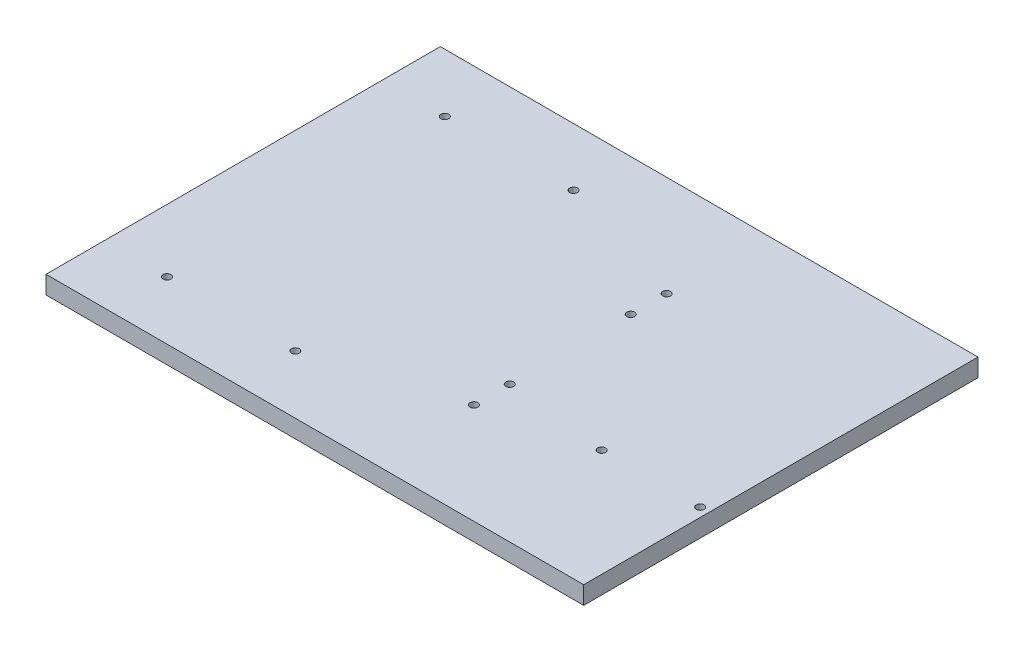
ISO-10303-21;
HEADER;
FILE_DESCRIPTION(('STEP AP214'),'2;1');
FILE_NAME('part.step','',(''),(''),'','','');
FILE_SCHEMA(('AUTOMOTIVE_DESIGN { 1 0 10303 214 1 1 1 1 }'));
ENDSEC;
DATA;
#1=APPLICATION_CONTEXT('core data for automotive mechanical design processes');
#2=APPLICATION_PROTOCOL_DEFINITION('international standard','automotive_design',2000,#1);
#3=PRODUCT_CONTEXT('',#1,'mechanical');
#4=PRODUCT('Part','Part','',(#3));
#5=PRODUCT_RELATED_PRODUCT_CATEGORY('part','',(#4));
#6=PRODUCT_DEFINITION_FORMATION('','',#4);
#7=PRODUCT_DEFINITION_CONTEXT('part definition',#1,'design');
#8=PRODUCT_DEFINITION('design','',#6,#7);
#9=PRODUCT_DEFINITION_SHAPE('','',#8);
#10=(LENGTH_UNIT() NAMED_UNIT(*) SI_UNIT(.MILLI.,.METRE.));
#11=(NAMED_UNIT(*) PLANE_ANGLE_UNIT() SI_UNIT($,.RADIAN.));
#12=(NAMED_UNIT(*) SI_UNIT($,.STERADIAN.) SOLID_ANGLE_UNIT());
#13=UNCERTAINTY_MEASURE_WITH_UNIT(LENGTH_MEASURE(1.E-05),#10,'distance_accuracy_value','');
#14=(GEOMETRIC_REPRESENTATION_CONTEXT(3) GLOBAL_UNCERTAINTY_ASSIGNED_CONTEXT((#13)) GLOBAL_UNIT_ASSIGNED_CONTEXT((#10,
#11,#12)) REPRESENTATION_CONTEXT('',''));
#15=CARTESIAN_POINT('',(0.,0.,0.));
#16=DIRECTION('',(0.,0.,1.));
#17=DIRECTION('',(1.,0.,0.));
#18=AXIS2_PLACEMENT_3D('',#15,#16,#17);
#19=CARTESIAN_POINT('',(0.,6.34999999999999,0.));
#20=DIRECTION('',(1.,0.,0.));
#21=DIRECTION('',(0.,0.,-1.));
#22=AXIS2_PLACEMENT_3D('',#19,#20,#21);
#23=PLANE('',#22);
#24=DIRECTION('',(0.,0.,1.));
#25=VECTOR('',#24,1.);
#26=CARTESIAN_POINT('',(0.,0.,0.));
#27=LINE('',#26,#25);
#28=CARTESIAN_POINT('',(0.,0.,-304.8));
#29=VERTEX_POINT('',#28);
#30=CARTESIAN_POINT('',(0.,0.,-165.1));
#31=VERTEX_POINT('',#30);
#32=EDGE_CURVE('E105',#29,#31,#27,.T.);
#33=ORIENTED_EDGE('',*,*,#32,.T.);
#34=DIRECTION('',(0.,1.,0.));
#35=VECTOR('',#34,1.);
#36=CARTESIAN_POINT('',(0.,0.,-165.1));
#37=LINE('',#36,#35);
#38=CARTESIAN_POINT('',(0.,6.34999999999999,-165.1));
#39=VERTEX_POINT('',#38);
#40=EDGE_CURVE('E108',#31,#39,#37,.T.);
#41=ORIENTED_EDGE('',*,*,#40,.T.);
#42=DIRECTION('',(0.,0.,1.));
#43=VECTOR('',#42,1.);
#44=CARTESIAN_POINT('',(0.,6.34999999999999,0.));
#45=LINE('',#44,#43);
#46=CARTESIAN_POINT('',(0.,6.34999999999999,-304.8));
#47=VERTEX_POINT('',#46);
#48=EDGE_CURVE('E106',#47,#39,#45,.T.);
#49=ORIENTED_EDGE('',*,*,#48,.F.);
#50=DIRECTION('',(0.,-1.,0.));
#51=VECTOR('',#50,1.);
#52=CARTESIAN_POINT('',(0.,6.34999999999999,-304.8));
#53=LINE('',#52,#51);
#54=EDGE_CURVE('E13',#47,#29,#53,.T.);
#55=ORIENTED_EDGE('',*,*,#54,.T.);
#56=EDGE_LOOP('',(#33,#41,#49,#55));
#57=FACE_BOUND('',#56,.T.);
#58=ADVANCED_FACE('F48',(#57),#23,.F.);
#59=CARTESIAN_POINT('',(0.,6.34999999999999,-304.8));
#60=DIRECTION('',(0.,0.,1.));
#61=DIRECTION('',(1.,0.,0.));
#62=AXIS2_PLACEMENT_3D('',#59,#60,#61);
#63=PLANE('',#62);
#64=DIRECTION('',(-1.,0.,0.));
#65=VECTOR('',#64,1.);
#66=CARTESIAN_POINT('',(0.,6.34999999999999,-304.8));
#67=LINE('',#66,#65);
#68=CARTESIAN_POINT('',(190.5,6.34999999999999,-304.8));
#69=VERTEX_POINT('',#68);
#70=EDGE_CURVE('E55',#69,#47,#67,.T.);
#71=ORIENTED_EDGE('',*,*,#70,.F.);
#72=DIRECTION('',(0.,1.,0.));
#73=VECTOR('',#72,1.);
#74=CARTESIAN_POINT('',(190.5,0.,-304.8));
#75=LINE('',#74,#73);
#76=CARTESIAN_POINT('',(190.5,0.,-304.8));
#77=VERTEX_POINT('',#76);
#78=EDGE_CURVE('E92',#77,#69,#75,.T.);
#79=ORIENTED_EDGE('',*,*,#78,.F.);
#80=DIRECTION('',(-1.,0.,0.));
#81=VECTOR('',#80,1.);
#82=CARTESIAN_POINT('',(0.,0.,-304.8));
#83=LINE('',#82,#81);
#84=EDGE_CURVE('E100',#77,#29,#83,.T.);
#85=ORIENTED_EDGE('',*,*,#84,.T.);
#86=ORIENTED_EDGE('',*,*,#54,.F.);
#87=EDGE_LOOP('',(#71,#79,#85,#86));
#88=FACE_BOUND('',#87,.T.);
#89=ADVANCED_FACE('F99',(#88),#63,.F.);
#90=CARTESIAN_POINT('',(0.,6.34999999999999,0.));
#91=DIRECTION('',(0.,-1.,0.));
#92=DIRECTION('',(0.,0.,-1.));
#93=AXIS2_PLACEMENT_3D('',#90,#91,#92);
#94=PLANE('',#93);
#95=CARTESIAN_POINT('',(187.325,6.34999999999999,-209.55));
#96=DIRECTION('',(0.,1.,0.));
#97=DIRECTION('',(0.,0.,1.));
#98=AXIS2_PLACEMENT_3D('',#95,#96,#97);
#99=CIRCLE('',#98,1.38906250000001);
#100=CARTESIAN_POINT('',(187.325,6.34999999999999,-208.1609375));
#101=VERTEX_POINT('',#100);
#102=EDGE_CURVE('E174',#101,#101,#99,.T.);
#103=ORIENTED_EDGE('',*,*,#102,.F.);
#104=EDGE_LOOP('',(#103));
#105=FACE_BOUND('',#104,.T.);
#106=CARTESIAN_POINT('',(152.4,6.34999999999999,-209.55));
#107=DIRECTION('',(0.,1.,0.));
#108=DIRECTION('',(0.,0.,1.));
#109=AXIS2_PLACEMENT_3D('',#106,#107,#108);
#110=CIRCLE('',#109,1.38906250000001);
#111=CARTESIAN_POINT('',(152.4,6.34999999999999,-208.1609375));
#112=VERTEX_POINT('',#111);
#113=EDGE_CURVE('E168',#112,#112,#110,.T.);
#114=ORIENTED_EDGE('',*,*,#113,.F.);
#115=EDGE_LOOP('',(#114));
#116=FACE_BOUND('',#115,.T.);
#117=CARTESIAN_POINT('',(115.8875,6.34999999999999,-269.08125));
#118=DIRECTION('',(0.,1.,0.));
#119=DIRECTION('',(0.,0.,1.));
#120=AXIS2_PLACEMENT_3D('',#117,#118,#119);
#121=CIRCLE('',#120,1.38906249999999);
#122=CARTESIAN_POINT('',(115.8875,6.34999999999999,-267.6921875));
#123=VERTEX_POINT('',#122);
#124=EDGE_CURVE('E157',#123,#123,#121,.T.);
#125=ORIENTED_EDGE('',*,*,#124,.F.);
#126=EDGE_LOOP('',(#125));
#127=FACE_BOUND('',#126,.T.);
#128=CARTESIAN_POINT('',(115.8875,6.34999999999999,-213.51875));
#129=DIRECTION('',(0.,1.,0.));
#130=DIRECTION('',(0.,0.,1.));
#131=AXIS2_PLACEMENT_3D('',#128,#129,#130);
#132=CIRCLE('',#131,1.3890625);
#133=CARTESIAN_POINT('',(115.8875,6.34999999999999,-212.1296875));
#134=VERTEX_POINT('',#133);
#135=EDGE_CURVE('E158',#134,#134,#132,.T.);
#136=ORIENTED_EDGE('',*,*,#135,.F.);
#137=EDGE_LOOP('',(#136));
#138=FACE_BOUND('',#137,.T.);
#139=CARTESIAN_POINT('',(115.8875,6.34999999999999,-200.81875));
#140=DIRECTION('',(0.,1.,0.));
#141=DIRECTION('',(0.,0.,1.));
#142=AXIS2_PLACEMENT_3D('',#139,#140,#141);
#143=CIRCLE('',#142,1.3890625);
#144=CARTESIAN_POINT('',(115.8875,6.34999999999999,-199.4296875));
#145=VERTEX_POINT('',#144);
#146=EDGE_CURVE('E144',#145,#145,#143,.T.);
#147=ORIENTED_EDGE('',*,*,#146,.F.);
#148=EDGE_LOOP('',(#147));
#149=FACE_BOUND('',#148,.T.);
#150=CARTESIAN_POINT('',(115.8875,6.34999999999999,-256.38125));
#151=DIRECTION('',(0.,1.,0.));
#152=DIRECTION('',(0.,0.,1.));
#153=AXIS2_PLACEMENT_3D('',#150,#151,#152);
#154=CIRCLE('',#153,1.38906249999996);
#155=CARTESIAN_POINT('',(115.8875,6.34999999999999,-254.9921875));
#156=VERTEX_POINT('',#155);
#157=EDGE_CURVE('E151',#156,#156,#154,.T.);
#158=ORIENTED_EDGE('',*,*,#157,.F.);
#159=EDGE_LOOP('',(#158));
#160=FACE_BOUND('',#159,.T.);
#161=CARTESIAN_POINT('',(67.691,6.34999999999999,-185.7375));
#162=DIRECTION('',(0.,1.,0.));
#163=DIRECTION('',(0.,0.,1.));
#164=AXIS2_PLACEMENT_3D('',#161,#162,#163);
#165=CIRCLE('',#164,1.3890625);
#166=CARTESIAN_POINT('',(67.691,6.34999999999999,-184.3484375));
#167=VERTEX_POINT('',#166);
#168=EDGE_CURVE('E133',#167,#167,#165,.T.);
#169=ORIENTED_EDGE('',*,*,#168,.F.);
#170=EDGE_LOOP('',(#169));
#171=FACE_BOUND('',#170,.T.);
#172=CARTESIAN_POINT('',(22.225,6.34999999999999,-284.1625));
#173=DIRECTION('',(0.,1.,0.));
#174=DIRECTION('',(0.,0.,1.));
#175=AXIS2_PLACEMENT_3D('',#172,#173,#174);
#176=CIRCLE('',#175,1.38906249999999);
#177=CARTESIAN_POINT('',(22.225,6.34999999999999,-282.7734375));
#178=VERTEX_POINT('',#177);
#179=EDGE_CURVE('E126',#178,#178,#176,.T.);
#180=ORIENTED_EDGE('',*,*,#179,.F.);
#181=EDGE_LOOP('',(#180));
#182=FACE_BOUND('',#181,.T.);
#183=CARTESIAN_POINT('',(67.691,6.34999999999999,-284.320434064186));
#184=DIRECTION('',(0.,1.,0.));
#185=DIRECTION('',(0.,0.,1.));
#186=AXIS2_PLACEMENT_3D('',#183,#184,#185);
#187=CIRCLE('',#186,1.38906249999999);
#188=CARTESIAN_POINT('',(67.691,6.34999999999999,-282.931371564186));
#189=VERTEX_POINT('',#188);
#190=EDGE_CURVE('E138',#189,#189,#187,.T.);
#191=ORIENTED_EDGE('',*,*,#190,.F.);
#192=EDGE_LOOP('',(#191));
#193=FACE_BOUND('',#192,.T.);
#194=CARTESIAN_POINT('',(22.225,6.34999999999999,-185.7375));
#195=DIRECTION('',(0.,1.,0.));
#196=DIRECTION('',(0.,0.,1.));
#197=AXIS2_PLACEMENT_3D('',#194,#195,#196);
#198=CIRCLE('',#197,1.38906250000001);
#199=CARTESIAN_POINT('',(22.225,6.34999999999999,-184.3484375));
#200=VERTEX_POINT('',#199);
#201=EDGE_CURVE('E120',#200,#200,#198,.T.);
#202=ORIENTED_EDGE('',*,*,#201,.F.);
#203=EDGE_LOOP('',(#202));
#204=FACE_BOUND('',#203,.T.);
#205=ORIENTED_EDGE('',*,*,#48,.T.);
#206=DIRECTION('',(-1.,0.,0.));
#207=VECTOR('',#206,1.);
#208=CARTESIAN_POINT('',(190.5,6.34999999999999,-165.1));
#209=LINE('',#208,#207);
#210=CARTESIAN_POINT('',(190.5,6.34999999999999,-165.1));
#211=VERTEX_POINT('',#210);
#212=EDGE_CURVE('E96',#211,#39,#209,.T.);
#213=ORIENTED_EDGE('',*,*,#212,.F.);
#214=DIRECTION('',(0.,0.,1.));
#215=VECTOR('',#214,1.);
#216=CARTESIAN_POINT('',(190.5,6.34999999999999,-304.8));
#217=LINE('',#216,#215);
#218=EDGE_CURVE('E116',#69,#211,#217,.T.);
#219=ORIENTED_EDGE('',*,*,#218,.F.);
#220=ORIENTED_EDGE('',*,*,#70,.T.);
#221=EDGE_LOOP('',(#205,#213,#219,#220));
#222=FACE_BOUND('',#221,.T.);
#223=ADVANCED_FACE('F189',(#105,#116,#127,#138,#149,#160,#171,#182,#193,#204,#222),#94,.F.);
#224=CARTESIAN_POINT('',(0.,0.,0.));
#225=DIRECTION('',(0.,-1.,0.));
#226=DIRECTION('',(0.,0.,-1.));
#227=AXIS2_PLACEMENT_3D('',#224,#225,#226);
#228=PLANE('',#227);
#229=CARTESIAN_POINT('',(187.325,0.,-209.55));
#230=DIRECTION('',(0.,1.,0.));
#231=DIRECTION('',(0.,0.,1.));
#232=AXIS2_PLACEMENT_3D('',#229,#230,#231);
#233=CIRCLE('',#232,1.38906250000001);
#234=CARTESIAN_POINT('',(187.325,0.,-208.1609375));
#235=VERTEX_POINT('',#234);
#236=EDGE_CURVE('E161',#235,#235,#233,.T.);
#237=ORIENTED_EDGE('',*,*,#236,.T.);
#238=EDGE_LOOP('',(#237));
#239=FACE_BOUND('',#238,.T.);
#240=CARTESIAN_POINT('',(152.4,0.,-209.55));
#241=DIRECTION('',(0.,1.,0.));
#242=DIRECTION('',(0.,0.,1.));
#243=AXIS2_PLACEMENT_3D('',#240,#241,#242);
#244=CIRCLE('',#243,1.38906250000001);
#245=CARTESIAN_POINT('',(152.4,0.,-208.1609375));
#246=VERTEX_POINT('',#245);
#247=EDGE_CURVE('E171',#246,#246,#244,.T.);
#248=ORIENTED_EDGE('',*,*,#247,.T.);
#249=EDGE_LOOP('',(#248));
#250=FACE_BOUND('',#249,.T.);
#251=CARTESIAN_POINT('',(115.8875,0.,-269.08125));
#252=DIRECTION('',(0.,1.,0.));
#253=DIRECTION('',(0.,0.,1.));
#254=AXIS2_PLACEMENT_3D('',#251,#252,#253);
#255=CIRCLE('',#254,1.38906249999999);
#256=CARTESIAN_POINT('',(115.8875,0.,-267.6921875));
#257=VERTEX_POINT('',#256);
#258=EDGE_CURVE('E141',#257,#257,#255,.T.);
#259=ORIENTED_EDGE('',*,*,#258,.T.);
#260=EDGE_LOOP('',(#259));
#261=FACE_BOUND('',#260,.T.);
#262=CARTESIAN_POINT('',(115.8875,0.,-213.51875));
#263=DIRECTION('',(0.,1.,0.));
#264=DIRECTION('',(0.,0.,1.));
#265=AXIS2_PLACEMENT_3D('',#262,#263,#264);
#266=CIRCLE('',#265,1.3890625);
#267=CARTESIAN_POINT('',(115.8875,0.,-212.1296875));
#268=VERTEX_POINT('',#267);
#269=EDGE_CURVE('E148',#268,#268,#266,.T.);
#270=ORIENTED_EDGE('',*,*,#269,.T.);
#271=EDGE_LOOP('',(#270));
#272=FACE_BOUND('',#271,.T.);
#273=CARTESIAN_POINT('',(115.8875,0.,-200.81875));
#274=DIRECTION('',(0.,1.,0.));
#275=DIRECTION('',(0.,0.,1.));
#276=AXIS2_PLACEMENT_3D('',#273,#274,#275);
#277=CIRCLE('',#276,1.3890625);
#278=CARTESIAN_POINT('',(115.8875,0.,-199.4296875));
#279=VERTEX_POINT('',#278);
#280=EDGE_CURVE('E147',#279,#279,#277,.T.);
#281=ORIENTED_EDGE('',*,*,#280,.T.);
#282=EDGE_LOOP('',(#281));
#283=FACE_BOUND('',#282,.T.);
#284=CARTESIAN_POINT('',(115.8875,0.,-256.38125));
#285=DIRECTION('',(0.,1.,0.));
#286=DIRECTION('',(0.,0.,1.));
#287=AXIS2_PLACEMENT_3D('',#284,#285,#286);
#288=CIRCLE('',#287,1.38906249999996);
#289=CARTESIAN_POINT('',(115.8875,0.,-254.9921875));
#290=VERTEX_POINT('',#289);
#291=EDGE_CURVE('E154',#290,#290,#288,.T.);
#292=ORIENTED_EDGE('',*,*,#291,.T.);
#293=EDGE_LOOP('',(#292));
#294=FACE_BOUND('',#293,.T.);
#295=CARTESIAN_POINT('',(67.691,0.,-185.7375));
#296=DIRECTION('',(0.,1.,0.));
#297=DIRECTION('',(0.,0.,1.));
#298=AXIS2_PLACEMENT_3D('',#295,#296,#297);
#299=CIRCLE('',#298,1.3890625);
#300=CARTESIAN_POINT('',(67.691,0.,-184.3484375));
#301=VERTEX_POINT('',#300);
#302=EDGE_CURVE('E123',#301,#301,#299,.T.);
#303=ORIENTED_EDGE('',*,*,#302,.T.);
#304=EDGE_LOOP('',(#303));
#305=FACE_BOUND('',#304,.T.);
#306=CARTESIAN_POINT('',(22.225,0.,-284.1625));
#307=DIRECTION('',(0.,1.,0.));
#308=DIRECTION('',(0.,0.,1.));
#309=AXIS2_PLACEMENT_3D('',#306,#307,#308);
#310=CIRCLE('',#309,1.38906249999999);
#311=CARTESIAN_POINT('',(22.225,0.,-282.7734375));
#312=VERTEX_POINT('',#311);
#313=EDGE_CURVE('E129',#312,#312,#310,.T.);
#314=ORIENTED_EDGE('',*,*,#313,.T.);
#315=EDGE_LOOP('',(#314));
#316=FACE_BOUND('',#315,.T.);
#317=CARTESIAN_POINT('',(67.691,0.,-284.320434064186));
#318=DIRECTION('',(0.,1.,0.));
#319=DIRECTION('',(0.,0.,1.));
#320=AXIS2_PLACEMENT_3D('',#317,#318,#319);
#321=CIRCLE('',#320,1.38906249999999);
#322=CARTESIAN_POINT('',(67.691,0.,-282.931371564186));
#323=VERTEX_POINT('',#322);
#324=EDGE_CURVE('E130',#323,#323,#321,.T.);
#325=ORIENTED_EDGE('',*,*,#324,.T.);
#326=EDGE_LOOP('',(#325));
#327=FACE_BOUND('',#326,.T.);
#328=CARTESIAN_POINT('',(22.225,0.,-185.7375));
#329=DIRECTION('',(0.,1.,0.));
#330=DIRECTION('',(0.,0.,1.));
#331=AXIS2_PLACEMENT_3D('',#328,#329,#330);
#332=CIRCLE('',#331,1.38906250000001);
#333=CARTESIAN_POINT('',(22.225,0.,-184.3484375));
#334=VERTEX_POINT('',#333);
#335=EDGE_CURVE('E118',#334,#334,#332,.T.);
#336=ORIENTED_EDGE('',*,*,#335,.T.);
#337=EDGE_LOOP('',(#336));
#338=FACE_BOUND('',#337,.T.);
#339=DIRECTION('',(-1.,0.,0.));
#340=VECTOR('',#339,1.);
#341=CARTESIAN_POINT('',(190.5,0.,-165.1));
#342=LINE('',#341,#340);
#343=CARTESIAN_POINT('',(190.5,0.,-165.1));
#344=VERTEX_POINT('',#343);
#345=EDGE_CURVE('E62',#344,#31,#342,.T.);
#346=ORIENTED_EDGE('',*,*,#345,.T.);
#347=ORIENTED_EDGE('',*,*,#32,.F.);
#348=ORIENTED_EDGE('',*,*,#84,.F.);
#349=DIRECTION('',(0.,0.,1.));
#350=VECTOR('',#349,1.);
#351=CARTESIAN_POINT('',(190.5,0.,-304.8));
#352=LINE('',#351,#350);
#353=EDGE_CURVE('E88',#77,#344,#352,.T.);
#354=ORIENTED_EDGE('',*,*,#353,.T.);
#355=EDGE_LOOP('',(#346,#347,#348,#354));
#356=FACE_BOUND('',#355,.T.);
#357=ADVANCED_FACE('F103',(#239,#250,#261,#272,#283,#294,#305,#316,#327,#338,#356),#228,.T.);
#358=CARTESIAN_POINT('',(190.5,0.,-165.1));
#359=DIRECTION('',(0.,0.,-1.));
#360=DIRECTION('',(-1.,0.,0.));
#361=AXIS2_PLACEMENT_3D('',#358,#359,#360);
#362=PLANE('',#361);
#363=ORIENTED_EDGE('',*,*,#212,.T.);
#364=ORIENTED_EDGE('',*,*,#40,.F.);
#365=ORIENTED_EDGE('',*,*,#345,.F.);
#366=DIRECTION('',(0.,1.,0.));
#367=VECTOR('',#366,1.);
#368=CARTESIAN_POINT('',(190.5,0.,-165.1));
#369=LINE('',#368,#367);
#370=EDGE_CURVE('E93',#344,#211,#369,.T.);
#371=ORIENTED_EDGE('',*,*,#370,.T.);
#372=EDGE_LOOP('',(#363,#364,#365,#371));
#373=FACE_BOUND('',#372,.T.);
#374=ADVANCED_FACE('F213',(#373),#362,.F.);
#375=CARTESIAN_POINT('',(190.5,0.,-304.8));
#376=DIRECTION('',(-1.,0.,0.));
#377=DIRECTION('',(0.,0.,1.));
#378=AXIS2_PLACEMENT_3D('',#375,#376,#377);
#379=PLANE('',#378);
#380=ORIENTED_EDGE('',*,*,#218,.T.);
#381=ORIENTED_EDGE('',*,*,#370,.F.);
#382=ORIENTED_EDGE('',*,*,#353,.F.);
#383=ORIENTED_EDGE('',*,*,#78,.T.);
#384=EDGE_LOOP('',(#380,#381,#382,#383));
#385=FACE_BOUND('',#384,.T.);
#386=ADVANCED_FACE('F91',(#385),#379,.F.);
#387=CARTESIAN_POINT('',(22.225,0.,-185.7375));
#388=DIRECTION('',(0.,1.,0.));
#389=DIRECTION('',(0.,0.,1.));
#390=AXIS2_PLACEMENT_3D('',#387,#388,#389);
#391=CYLINDRICAL_SURFACE('',#390,1.38906250000001);
#392=ORIENTED_EDGE('',*,*,#335,.F.);
#393=EDGE_LOOP('',(#392));
#394=FACE_BOUND('',#393,.T.);
#395=ORIENTED_EDGE('',*,*,#201,.T.);
#396=EDGE_LOOP('',(#395));
#397=FACE_BOUND('',#396,.T.);
#398=ADVANCED_FACE('F220',(#394,#397),#391,.F.);
#399=CARTESIAN_POINT('',(67.691,0.,-284.320434064186));
#400=DIRECTION('',(0.,1.,0.));
#401=DIRECTION('',(0.,0.,1.));
#402=AXIS2_PLACEMENT_3D('',#399,#400,#401);
#403=CYLINDRICAL_SURFACE('',#402,1.38906249999999);
#404=ORIENTED_EDGE('',*,*,#324,.F.);
#405=EDGE_LOOP('',(#404));
#406=FACE_BOUND('',#405,.T.);
#407=ORIENTED_EDGE('',*,*,#190,.T.);
#408=EDGE_LOOP('',(#407));
#409=FACE_BOUND('',#408,.T.);
#410=ADVANCED_FACE('F251',(#406,#409),#403,.F.);
#411=CARTESIAN_POINT('',(22.225,0.,-284.1625));
#412=DIRECTION('',(0.,1.,0.));
#413=DIRECTION('',(0.,0.,1.));
#414=AXIS2_PLACEMENT_3D('',#411,#412,#413);
#415=CYLINDRICAL_SURFACE('',#414,1.38906249999999);
#416=ORIENTED_EDGE('',*,*,#313,.F.);
#417=EDGE_LOOP('',(#416));
#418=FACE_BOUND('',#417,.T.);
#419=ORIENTED_EDGE('',*,*,#179,.T.);
#420=EDGE_LOOP('',(#419));
#421=FACE_BOUND('',#420,.T.);
#422=ADVANCED_FACE('F258',(#418,#421),#415,.F.);
#423=CARTESIAN_POINT('',(67.691,0.,-185.7375));
#424=DIRECTION('',(0.,1.,0.));
#425=DIRECTION('',(0.,0.,1.));
#426=AXIS2_PLACEMENT_3D('',#423,#424,#425);
#427=CYLINDRICAL_SURFACE('',#426,1.3890625);
#428=ORIENTED_EDGE('',*,*,#302,.F.);
#429=EDGE_LOOP('',(#428));
#430=FACE_BOUND('',#429,.T.);
#431=ORIENTED_EDGE('',*,*,#168,.T.);
#432=EDGE_LOOP('',(#431));
#433=FACE_BOUND('',#432,.T.);
#434=ADVANCED_FACE('F266',(#430,#433),#427,.F.);
#435=CARTESIAN_POINT('',(115.8875,0.,-256.38125));
#436=DIRECTION('',(0.,1.,0.));
#437=DIRECTION('',(0.,0.,1.));
#438=AXIS2_PLACEMENT_3D('',#435,#436,#437);
#439=CYLINDRICAL_SURFACE('',#438,1.38906249999996);
#440=ORIENTED_EDGE('',*,*,#291,.F.);
#441=EDGE_LOOP('',(#440));
#442=FACE_BOUND('',#441,.T.);
#443=ORIENTED_EDGE('',*,*,#157,.T.);
#444=EDGE_LOOP('',(#443));
#445=FACE_BOUND('',#444,.T.);
#446=ADVANCED_FACE('F274',(#442,#445),#439,.F.);
#447=CARTESIAN_POINT('',(115.8875,0.,-200.81875));
#448=DIRECTION('',(0.,1.,0.));
#449=DIRECTION('',(0.,0.,1.));
#450=AXIS2_PLACEMENT_3D('',#447,#448,#449);
#451=CYLINDRICAL_SURFACE('',#450,1.3890625);
#452=ORIENTED_EDGE('',*,*,#280,.F.);
#453=EDGE_LOOP('',(#452));
#454=FACE_BOUND('',#453,.T.);
#455=ORIENTED_EDGE('',*,*,#146,.T.);
#456=EDGE_LOOP('',(#455));
#457=FACE_BOUND('',#456,.T.);
#458=ADVANCED_FACE('F282',(#454,#457),#451,.F.);
#459=CARTESIAN_POINT('',(115.8875,0.,-213.51875));
#460=DIRECTION('',(0.,1.,0.));
#461=DIRECTION('',(0.,0.,1.));
#462=AXIS2_PLACEMENT_3D('',#459,#460,#461);
#463=CYLINDRICAL_SURFACE('',#462,1.3890625);
#464=ORIENTED_EDGE('',*,*,#269,.F.);
#465=EDGE_LOOP('',(#464));
#466=FACE_BOUND('',#465,.T.);
#467=ORIENTED_EDGE('',*,*,#135,.T.);
#468=EDGE_LOOP('',(#467));
#469=FACE_BOUND('',#468,.T.);
#470=ADVANCED_FACE('F290',(#466,#469),#463,.F.);
#471=CARTESIAN_POINT('',(115.8875,0.,-269.08125));
#472=DIRECTION('',(0.,1.,0.));
#473=DIRECTION('',(0.,0.,1.));
#474=AXIS2_PLACEMENT_3D('',#471,#472,#473);
#475=CYLINDRICAL_SURFACE('',#474,1.38906249999999);
#476=ORIENTED_EDGE('',*,*,#258,.F.);
#477=EDGE_LOOP('',(#476));
#478=FACE_BOUND('',#477,.T.);
#479=ORIENTED_EDGE('',*,*,#124,.T.);
#480=EDGE_LOOP('',(#479));
#481=FACE_BOUND('',#480,.T.);
#482=ADVANCED_FACE('F298',(#478,#481),#475,.F.);
#483=CARTESIAN_POINT('',(152.4,0.,-209.55));
#484=DIRECTION('',(0.,1.,0.));
#485=DIRECTION('',(0.,0.,1.));
#486=AXIS2_PLACEMENT_3D('',#483,#484,#485);
#487=CYLINDRICAL_SURFACE('',#486,1.38906250000001);
#488=ORIENTED_EDGE('',*,*,#247,.F.);
#489=EDGE_LOOP('',(#488));
#490=FACE_BOUND('',#489,.T.);
#491=ORIENTED_EDGE('',*,*,#113,.T.);
#492=EDGE_LOOP('',(#491));
#493=FACE_BOUND('',#492,.T.);
#494=ADVANCED_FACE('F185',(#490,#493),#487,.F.);
#495=CARTESIAN_POINT('',(187.325,0.,-209.55));
#496=DIRECTION('',(0.,1.,0.));
#497=DIRECTION('',(0.,0.,1.));
#498=AXIS2_PLACEMENT_3D('',#495,#496,#497);
#499=CYLINDRICAL_SURFACE('',#498,1.38906250000001);
#500=ORIENTED_EDGE('',*,*,#236,.F.);
#501=EDGE_LOOP('',(#500));
#502=FACE_BOUND('',#501,.T.);
#503=ORIENTED_EDGE('',*,*,#102,.T.);
#504=EDGE_LOOP('',(#503));
#505=FACE_BOUND('',#504,.T.);
#506=ADVANCED_FACE('F182',(#502,#505),#499,.F.);
#507=CLOSED_SHELL('',(#58,#89,#223,#357,#374,#386,#398,#410,#422,#434,#446,#458,#470,#482,#494,#506));
#508=MANIFOLD_SOLID_BREP('B2',#507);
#509=ADVANCED_BREP_SHAPE_REPRESENTATION('',(#18,#508),#14);
#510=SHAPE_DEFINITION_REPRESENTATION(#9,#509);
ENDSEC;
END-ISO-10303-21;
